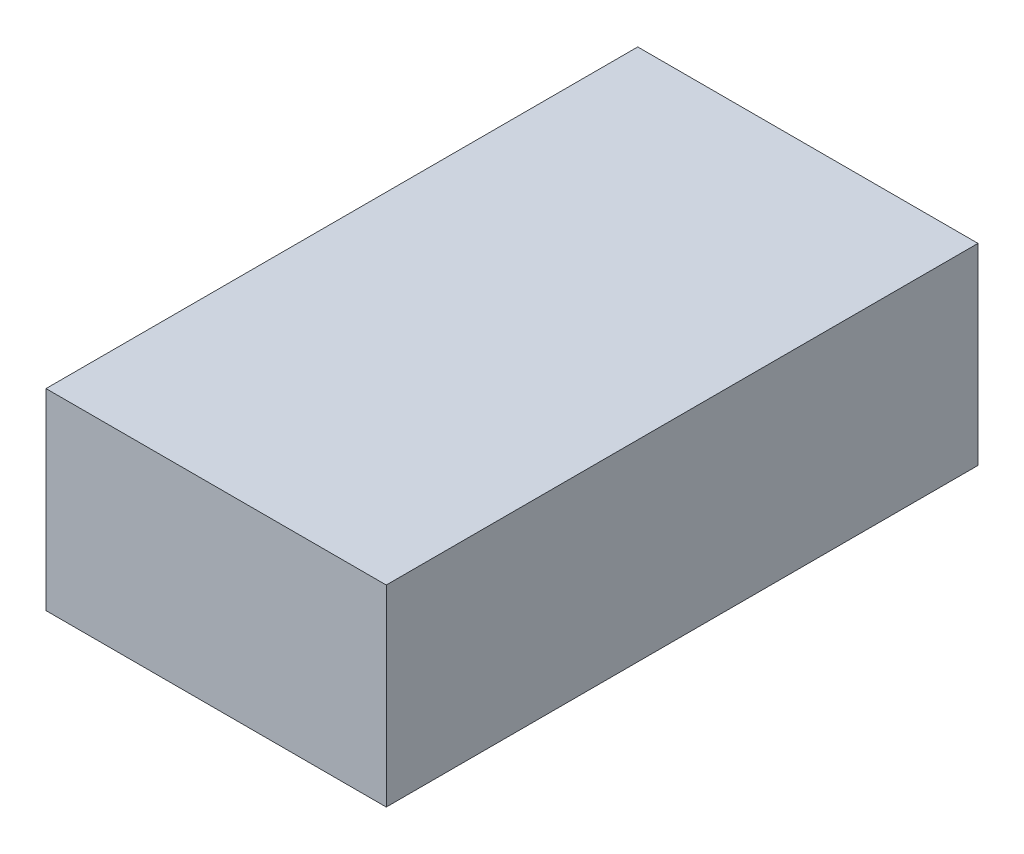
ISO-10303-21;
HEADER;
FILE_DESCRIPTION(('STEP AP214'),'2;1');
FILE_NAME('part.step','',(''),(''),'','','');
FILE_SCHEMA(('AUTOMOTIVE_DESIGN { 1 0 10303 214 1 1 1 1 }'));
ENDSEC;
DATA;
#1=APPLICATION_CONTEXT('core data for automotive mechanical design processes');
#2=APPLICATION_PROTOCOL_DEFINITION('international standard','automotive_design',2000,#1);
#3=PRODUCT_CONTEXT('',#1,'mechanical');
#4=PRODUCT('Part','Part','',(#3));
#5=PRODUCT_RELATED_PRODUCT_CATEGORY('part','',(#4));
#6=PRODUCT_DEFINITION_FORMATION('','',#4);
#7=PRODUCT_DEFINITION_CONTEXT('part definition',#1,'design');
#8=PRODUCT_DEFINITION('design','',#6,#7);
#9=PRODUCT_DEFINITION_SHAPE('','',#8);
#10=(LENGTH_UNIT() NAMED_UNIT(*) SI_UNIT(.MILLI.,.METRE.));
#11=(NAMED_UNIT(*) PLANE_ANGLE_UNIT() SI_UNIT($,.RADIAN.));
#12=(NAMED_UNIT(*) SI_UNIT($,.STERADIAN.) SOLID_ANGLE_UNIT());
#13=UNCERTAINTY_MEASURE_WITH_UNIT(LENGTH_MEASURE(1.E-05),#10,'distance_accuracy_value','');
#14=(GEOMETRIC_REPRESENTATION_CONTEXT(3) GLOBAL_UNCERTAINTY_ASSIGNED_CONTEXT((#13)) GLOBAL_UNIT_ASSIGNED_CONTEXT((#10,
#11,#12)) REPRESENTATION_CONTEXT('',''));
#15=CARTESIAN_POINT('',(0.,0.,0.));
#16=DIRECTION('',(0.,0.,1.));
#17=DIRECTION('',(1.,0.,0.));
#18=AXIS2_PLACEMENT_3D('',#15,#16,#17);
#19=CARTESIAN_POINT('',(11.5,13.,-20.));
#20=DIRECTION('',(-1.,0.,0.));
#21=DIRECTION('',(0.,0.,1.));
#22=AXIS2_PLACEMENT_3D('',#19,#20,#21);
#23=PLANE('',#22);
#24=DIRECTION('',(0.,0.,-1.));
#25=VECTOR('',#24,1.);
#26=CARTESIAN_POINT('',(11.5,0.,-20.));
#27=LINE('',#26,#25);
#28=CARTESIAN_POINT('',(11.5,0.,20.));
#29=VERTEX_POINT('',#28);
#30=CARTESIAN_POINT('',(11.5,0.,-20.));
#31=VERTEX_POINT('',#30);
#32=EDGE_CURVE('E102',#29,#31,#27,.T.);
#33=ORIENTED_EDGE('',*,*,#32,.T.);
#34=DIRECTION('',(0.,-1.,0.));
#35=VECTOR('',#34,1.);
#36=CARTESIAN_POINT('',(11.5,13.,-20.));
#37=LINE('',#36,#35);
#38=CARTESIAN_POINT('',(11.5,13.,-20.));
#39=VERTEX_POINT('',#38);
#40=EDGE_CURVE('E11',#39,#31,#37,.T.);
#41=ORIENTED_EDGE('',*,*,#40,.F.);
#42=DIRECTION('',(0.,0.,-1.));
#43=VECTOR('',#42,1.);
#44=CARTESIAN_POINT('',(11.5,13.,-20.));
#45=LINE('',#44,#43);
#46=CARTESIAN_POINT('',(11.5,13.,20.));
#47=VERTEX_POINT('',#46);
#48=EDGE_CURVE('E90',#47,#39,#45,.T.);
#49=ORIENTED_EDGE('',*,*,#48,.F.);
#50=DIRECTION('',(0.,-1.,0.));
#51=VECTOR('',#50,1.);
#52=CARTESIAN_POINT('',(11.5,13.,20.));
#53=LINE('',#52,#51);
#54=EDGE_CURVE('E98',#47,#29,#53,.T.);
#55=ORIENTED_EDGE('',*,*,#54,.T.);
#56=EDGE_LOOP('',(#33,#41,#49,#55));
#57=FACE_BOUND('',#56,.T.);
#58=ADVANCED_FACE('F39',(#57),#23,.F.);
#59=CARTESIAN_POINT('',(-11.5,13.,-20.));
#60=DIRECTION('',(0.,0.,1.));
#61=DIRECTION('',(1.,0.,0.));
#62=AXIS2_PLACEMENT_3D('',#59,#60,#61);
#63=PLANE('',#62);
#64=DIRECTION('',(-1.,0.,0.));
#65=VECTOR('',#64,1.);
#66=CARTESIAN_POINT('',(-11.5,0.,-20.));
#67=LINE('',#66,#65);
#68=CARTESIAN_POINT('',(-11.5,0.,-20.));
#69=VERTEX_POINT('',#68);
#70=EDGE_CURVE('E94',#31,#69,#67,.T.);
#71=ORIENTED_EDGE('',*,*,#70,.T.);
#72=DIRECTION('',(0.,-1.,0.));
#73=VECTOR('',#72,1.);
#74=CARTESIAN_POINT('',(-11.5,13.,-20.));
#75=LINE('',#74,#73);
#76=CARTESIAN_POINT('',(-11.5,13.,-20.));
#77=VERTEX_POINT('',#76);
#78=EDGE_CURVE('E47',#77,#69,#75,.T.);
#79=ORIENTED_EDGE('',*,*,#78,.F.);
#80=DIRECTION('',(-1.,0.,0.));
#81=VECTOR('',#80,1.);
#82=CARTESIAN_POINT('',(-11.5,13.,-20.));
#83=LINE('',#82,#81);
#84=EDGE_CURVE('E85',#39,#77,#83,.T.);
#85=ORIENTED_EDGE('',*,*,#84,.F.);
#86=ORIENTED_EDGE('',*,*,#40,.T.);
#87=EDGE_LOOP('',(#71,#79,#85,#86));
#88=FACE_BOUND('',#87,.T.);
#89=ADVANCED_FACE('F93',(#88),#63,.F.);
#90=CARTESIAN_POINT('',(-11.5,13.,-20.));
#91=DIRECTION('',(1.,0.,0.));
#92=DIRECTION('',(0.,0.,-1.));
#93=AXIS2_PLACEMENT_3D('',#90,#91,#92);
#94=PLANE('',#93);
#95=DIRECTION('',(0.,0.,1.));
#96=VECTOR('',#95,1.);
#97=CARTESIAN_POINT('',(-11.5,0.,-20.));
#98=LINE('',#97,#96);
#99=CARTESIAN_POINT('',(-11.5,0.,20.));
#100=VERTEX_POINT('',#99);
#101=EDGE_CURVE('E72',#69,#100,#98,.T.);
#102=ORIENTED_EDGE('',*,*,#101,.T.);
#103=DIRECTION('',(0.,-1.,0.));
#104=VECTOR('',#103,1.);
#105=CARTESIAN_POINT('',(-11.5,13.,20.));
#106=LINE('',#105,#104);
#107=CARTESIAN_POINT('',(-11.5,13.,20.));
#108=VERTEX_POINT('',#107);
#109=EDGE_CURVE('E95',#108,#100,#106,.T.);
#110=ORIENTED_EDGE('',*,*,#109,.F.);
#111=DIRECTION('',(0.,0.,1.));
#112=VECTOR('',#111,1.);
#113=CARTESIAN_POINT('',(-11.5,13.,-20.));
#114=LINE('',#113,#112);
#115=EDGE_CURVE('E88',#77,#108,#114,.T.);
#116=ORIENTED_EDGE('',*,*,#115,.F.);
#117=ORIENTED_EDGE('',*,*,#78,.T.);
#118=EDGE_LOOP('',(#102,#110,#116,#117));
#119=FACE_BOUND('',#118,.T.);
#120=ADVANCED_FACE('F96',(#119),#94,.F.);
#121=CARTESIAN_POINT('',(-11.5,13.,20.));
#122=DIRECTION('',(0.,0.,-1.));
#123=DIRECTION('',(-1.,0.,0.));
#124=AXIS2_PLACEMENT_3D('',#121,#122,#123);
#125=PLANE('',#124);
#126=DIRECTION('',(1.,0.,0.));
#127=VECTOR('',#126,1.);
#128=CARTESIAN_POINT('',(-11.5,0.,20.));
#129=LINE('',#128,#127);
#130=EDGE_CURVE('E78',#100,#29,#129,.T.);
#131=ORIENTED_EDGE('',*,*,#130,.T.);
#132=ORIENTED_EDGE('',*,*,#54,.F.);
#133=DIRECTION('',(1.,0.,0.));
#134=VECTOR('',#133,1.);
#135=CARTESIAN_POINT('',(-11.5,13.,20.));
#136=LINE('',#135,#134);
#137=EDGE_CURVE('E55',#108,#47,#136,.T.);
#138=ORIENTED_EDGE('',*,*,#137,.F.);
#139=ORIENTED_EDGE('',*,*,#109,.T.);
#140=EDGE_LOOP('',(#131,#132,#138,#139));
#141=FACE_BOUND('',#140,.T.);
#142=ADVANCED_FACE('F109',(#141),#125,.F.);
#143=CARTESIAN_POINT('',(0.,13.,0.));
#144=DIRECTION('',(0.,1.,0.));
#145=DIRECTION('',(0.,0.,1.));
#146=AXIS2_PLACEMENT_3D('',#143,#144,#145);
#147=PLANE('',#146);
#148=ORIENTED_EDGE('',*,*,#48,.T.);
#149=ORIENTED_EDGE('',*,*,#84,.T.);
#150=ORIENTED_EDGE('',*,*,#115,.T.);
#151=ORIENTED_EDGE('',*,*,#137,.T.);
#152=EDGE_LOOP('',(#148,#149,#150,#151));
#153=FACE_BOUND('',#152,.T.);
#154=ADVANCED_FACE('F86',(#153),#147,.T.);
#155=CARTESIAN_POINT('',(0.,0.,0.));
#156=DIRECTION('',(0.,1.,0.));
#157=DIRECTION('',(0.,0.,1.));
#158=AXIS2_PLACEMENT_3D('',#155,#156,#157);
#159=PLANE('',#158);
#160=ORIENTED_EDGE('',*,*,#32,.F.);
#161=ORIENTED_EDGE('',*,*,#130,.F.);
#162=ORIENTED_EDGE('',*,*,#101,.F.);
#163=ORIENTED_EDGE('',*,*,#70,.F.);
#164=EDGE_LOOP('',(#160,#161,#162,#163));
#165=FACE_BOUND('',#164,.T.);
#166=ADVANCED_FACE('F112',(#165),#159,.F.);
#167=CLOSED_SHELL('',(#58,#89,#120,#142,#154,#166));
#168=MANIFOLD_SOLID_BREP('B2',#167);
#169=ADVANCED_BREP_SHAPE_REPRESENTATION('',(#18,#168),#14);
#170=SHAPE_DEFINITION_REPRESENTATION(#9,#169);
ENDSEC;
END-ISO-10303-21;
